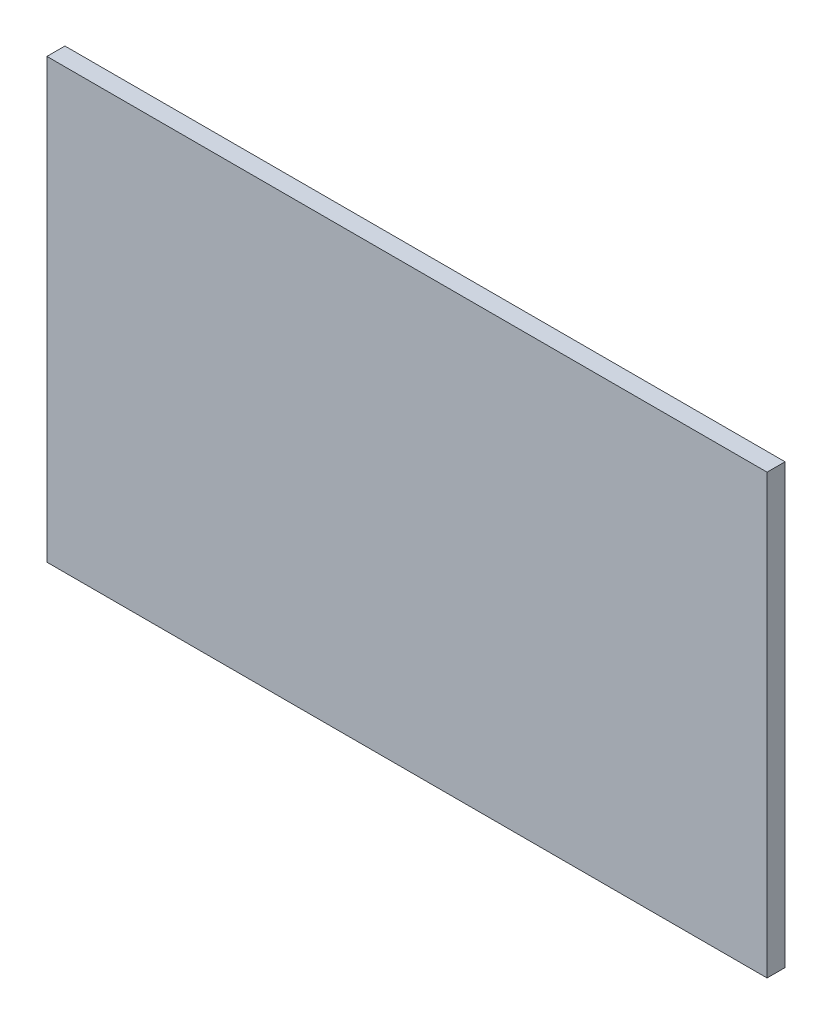
ISO-10303-21;
HEADER;
FILE_DESCRIPTION(('STEP AP214'),'2;1');
FILE_NAME('part.step','',(''),(''),'','','');
FILE_SCHEMA(('AUTOMOTIVE_DESIGN { 1 0 10303 214 1 1 1 1 }'));
ENDSEC;
DATA;
#1=APPLICATION_CONTEXT('core data for automotive mechanical design processes');
#2=APPLICATION_PROTOCOL_DEFINITION('international standard','automotive_design',2000,#1);
#3=PRODUCT_CONTEXT('',#1,'mechanical');
#4=PRODUCT('Part','Part','',(#3));
#5=PRODUCT_RELATED_PRODUCT_CATEGORY('part','',(#4));
#6=PRODUCT_DEFINITION_FORMATION('','',#4);
#7=PRODUCT_DEFINITION_CONTEXT('part definition',#1,'design');
#8=PRODUCT_DEFINITION('design','',#6,#7);
#9=PRODUCT_DEFINITION_SHAPE('','',#8);
#10=(LENGTH_UNIT() NAMED_UNIT(*) SI_UNIT(.MILLI.,.METRE.));
#11=(NAMED_UNIT(*) PLANE_ANGLE_UNIT() SI_UNIT($,.RADIAN.));
#12=(NAMED_UNIT(*) SI_UNIT($,.STERADIAN.) SOLID_ANGLE_UNIT());
#13=UNCERTAINTY_MEASURE_WITH_UNIT(LENGTH_MEASURE(1.E-05),#10,'distance_accuracy_value','');
#14=(GEOMETRIC_REPRESENTATION_CONTEXT(3) GLOBAL_UNCERTAINTY_ASSIGNED_CONTEXT((#13)) GLOBAL_UNIT_ASSIGNED_CONTEXT((#10,
#11,#12)) REPRESENTATION_CONTEXT('',''));
#15=CARTESIAN_POINT('',(0.,0.,0.));
#16=DIRECTION('',(0.,0.,1.));
#17=DIRECTION('',(1.,0.,0.));
#18=AXIS2_PLACEMENT_3D('',#15,#16,#17);
#19=CARTESIAN_POINT('',(60.,-36.5,3.));
#20=DIRECTION('',(-1.,0.,0.));
#21=DIRECTION('',(0.,0.,1.));
#22=AXIS2_PLACEMENT_3D('',#19,#20,#21);
#23=PLANE('',#22);
#24=DIRECTION('',(0.,1.,0.));
#25=VECTOR('',#24,1.);
#26=CARTESIAN_POINT('',(60.,-36.5,0.));
#27=LINE('',#26,#25);
#28=CARTESIAN_POINT('',(60.,-36.5,0.));
#29=VERTEX_POINT('',#28);
#30=CARTESIAN_POINT('',(60.,36.5,0.));
#31=VERTEX_POINT('',#30);
#32=EDGE_CURVE('E96',#29,#31,#27,.T.);
#33=ORIENTED_EDGE('',*,*,#32,.T.);
#34=DIRECTION('',(0.,0.,-1.));
#35=VECTOR('',#34,1.);
#36=CARTESIAN_POINT('',(60.,36.5,3.));
#37=LINE('',#36,#35);
#38=CARTESIAN_POINT('',(60.,36.5,3.));
#39=VERTEX_POINT('',#38);
#40=EDGE_CURVE('E11',#39,#31,#37,.T.);
#41=ORIENTED_EDGE('',*,*,#40,.F.);
#42=DIRECTION('',(0.,1.,0.));
#43=VECTOR('',#42,1.);
#44=CARTESIAN_POINT('',(60.,-36.5,3.));
#45=LINE('',#44,#43);
#46=CARTESIAN_POINT('',(60.,-36.5,3.));
#47=VERTEX_POINT('',#46);
#48=EDGE_CURVE('E84',#47,#39,#45,.T.);
#49=ORIENTED_EDGE('',*,*,#48,.F.);
#50=DIRECTION('',(0.,0.,-1.));
#51=VECTOR('',#50,1.);
#52=CARTESIAN_POINT('',(60.,-36.5,3.));
#53=LINE('',#52,#51);
#54=EDGE_CURVE('E92',#47,#29,#53,.T.);
#55=ORIENTED_EDGE('',*,*,#54,.T.);
#56=EDGE_LOOP('',(#33,#41,#49,#55));
#57=FACE_BOUND('',#56,.T.);
#58=ADVANCED_FACE('F33',(#57),#23,.F.);
#59=CARTESIAN_POINT('',(-60.,36.5,3.));
#60=DIRECTION('',(0.,-1.,0.));
#61=DIRECTION('',(0.,0.,-1.));
#62=AXIS2_PLACEMENT_3D('',#59,#60,#61);
#63=PLANE('',#62);
#64=DIRECTION('',(-1.,0.,0.));
#65=VECTOR('',#64,1.);
#66=CARTESIAN_POINT('',(-60.,36.5,0.));
#67=LINE('',#66,#65);
#68=CARTESIAN_POINT('',(-60.,36.5,0.));
#69=VERTEX_POINT('',#68);
#70=EDGE_CURVE('E88',#31,#69,#67,.T.);
#71=ORIENTED_EDGE('',*,*,#70,.T.);
#72=DIRECTION('',(0.,0.,-1.));
#73=VECTOR('',#72,1.);
#74=CARTESIAN_POINT('',(-60.,36.5,3.));
#75=LINE('',#74,#73);
#76=CARTESIAN_POINT('',(-60.,36.5,3.));
#77=VERTEX_POINT('',#76);
#78=EDGE_CURVE('E41',#77,#69,#75,.T.);
#79=ORIENTED_EDGE('',*,*,#78,.F.);
#80=DIRECTION('',(-1.,0.,0.));
#81=VECTOR('',#80,1.);
#82=CARTESIAN_POINT('',(-60.,36.5,3.));
#83=LINE('',#82,#81);
#84=EDGE_CURVE('E79',#39,#77,#83,.T.);
#85=ORIENTED_EDGE('',*,*,#84,.F.);
#86=ORIENTED_EDGE('',*,*,#40,.T.);
#87=EDGE_LOOP('',(#71,#79,#85,#86));
#88=FACE_BOUND('',#87,.T.);
#89=ADVANCED_FACE('F87',(#88),#63,.F.);
#90=CARTESIAN_POINT('',(-60.,-36.5,3.));
#91=DIRECTION('',(1.,0.,0.));
#92=DIRECTION('',(0.,0.,-1.));
#93=AXIS2_PLACEMENT_3D('',#90,#91,#92);
#94=PLANE('',#93);
#95=DIRECTION('',(0.,-1.,0.));
#96=VECTOR('',#95,1.);
#97=CARTESIAN_POINT('',(-60.,-36.5,0.));
#98=LINE('',#97,#96);
#99=CARTESIAN_POINT('',(-60.,-36.5,0.));
#100=VERTEX_POINT('',#99);
#101=EDGE_CURVE('E66',#69,#100,#98,.T.);
#102=ORIENTED_EDGE('',*,*,#101,.T.);
#103=DIRECTION('',(0.,0.,-1.));
#104=VECTOR('',#103,1.);
#105=CARTESIAN_POINT('',(-60.,-36.5,3.));
#106=LINE('',#105,#104);
#107=CARTESIAN_POINT('',(-60.,-36.5,3.));
#108=VERTEX_POINT('',#107);
#109=EDGE_CURVE('E89',#108,#100,#106,.T.);
#110=ORIENTED_EDGE('',*,*,#109,.F.);
#111=DIRECTION('',(0.,-1.,0.));
#112=VECTOR('',#111,1.);
#113=CARTESIAN_POINT('',(-60.,-36.5,3.));
#114=LINE('',#113,#112);
#115=EDGE_CURVE('E82',#77,#108,#114,.T.);
#116=ORIENTED_EDGE('',*,*,#115,.F.);
#117=ORIENTED_EDGE('',*,*,#78,.T.);
#118=EDGE_LOOP('',(#102,#110,#116,#117));
#119=FACE_BOUND('',#118,.T.);
#120=ADVANCED_FACE('F90',(#119),#94,.F.);
#121=CARTESIAN_POINT('',(-60.,-36.5,3.));
#122=DIRECTION('',(0.,1.,0.));
#123=DIRECTION('',(0.,0.,1.));
#124=AXIS2_PLACEMENT_3D('',#121,#122,#123);
#125=PLANE('',#124);
#126=DIRECTION('',(1.,0.,0.));
#127=VECTOR('',#126,1.);
#128=CARTESIAN_POINT('',(-60.,-36.5,0.));
#129=LINE('',#128,#127);
#130=EDGE_CURVE('E72',#100,#29,#129,.T.);
#131=ORIENTED_EDGE('',*,*,#130,.T.);
#132=ORIENTED_EDGE('',*,*,#54,.F.);
#133=DIRECTION('',(1.,0.,0.));
#134=VECTOR('',#133,1.);
#135=CARTESIAN_POINT('',(-60.,-36.5,3.));
#136=LINE('',#135,#134);
#137=EDGE_CURVE('E49',#108,#47,#136,.T.);
#138=ORIENTED_EDGE('',*,*,#137,.F.);
#139=ORIENTED_EDGE('',*,*,#109,.T.);
#140=EDGE_LOOP('',(#131,#132,#138,#139));
#141=FACE_BOUND('',#140,.T.);
#142=ADVANCED_FACE('F103',(#141),#125,.F.);
#143=CARTESIAN_POINT('',(0.,0.,3.));
#144=DIRECTION('',(0.,0.,-1.));
#145=DIRECTION('',(-1.,0.,0.));
#146=AXIS2_PLACEMENT_3D('',#143,#144,#145);
#147=PLANE('',#146);
#148=ORIENTED_EDGE('',*,*,#48,.T.);
#149=ORIENTED_EDGE('',*,*,#84,.T.);
#150=ORIENTED_EDGE('',*,*,#115,.T.);
#151=ORIENTED_EDGE('',*,*,#137,.T.);
#152=EDGE_LOOP('',(#148,#149,#150,#151));
#153=FACE_BOUND('',#152,.T.);
#154=ADVANCED_FACE('F80',(#153),#147,.F.);
#155=CARTESIAN_POINT('',(0.,0.,0.));
#156=DIRECTION('',(0.,0.,-1.));
#157=DIRECTION('',(-1.,0.,0.));
#158=AXIS2_PLACEMENT_3D('',#155,#156,#157);
#159=PLANE('',#158);
#160=ORIENTED_EDGE('',*,*,#32,.F.);
#161=ORIENTED_EDGE('',*,*,#130,.F.);
#162=ORIENTED_EDGE('',*,*,#101,.F.);
#163=ORIENTED_EDGE('',*,*,#70,.F.);
#164=EDGE_LOOP('',(#160,#161,#162,#163));
#165=FACE_BOUND('',#164,.T.);
#166=ADVANCED_FACE('F106',(#165),#159,.T.);
#167=CLOSED_SHELL('',(#58,#89,#120,#142,#154,#166));
#168=MANIFOLD_SOLID_BREP('B2',#167);
#169=ADVANCED_BREP_SHAPE_REPRESENTATION('',(#18,#168),#14);
#170=SHAPE_DEFINITION_REPRESENTATION(#9,#169);
ENDSEC;
END-ISO-10303-21;
